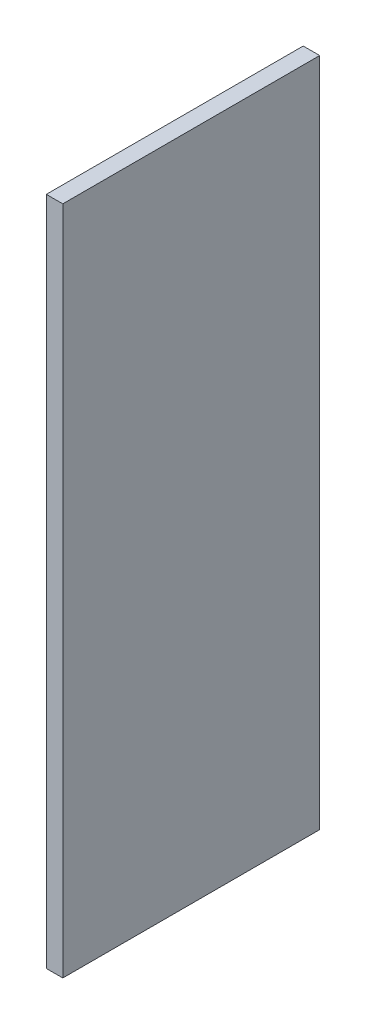
ISO-10303-21;
HEADER;
FILE_DESCRIPTION(('STEP AP214'),'2;1');
FILE_NAME('part.step','',(''),(''),'','','');
FILE_SCHEMA(('AUTOMOTIVE_DESIGN { 1 0 10303 214 1 1 1 1 }'));
ENDSEC;
DATA;
#1=APPLICATION_CONTEXT('core data for automotive mechanical design processes');
#2=APPLICATION_PROTOCOL_DEFINITION('international standard','automotive_design',2000,#1);
#3=PRODUCT_CONTEXT('',#1,'mechanical');
#4=PRODUCT('Part','Part','',(#3));
#5=PRODUCT_RELATED_PRODUCT_CATEGORY('part','',(#4));
#6=PRODUCT_DEFINITION_FORMATION('','',#4);
#7=PRODUCT_DEFINITION_CONTEXT('part definition',#1,'design');
#8=PRODUCT_DEFINITION('design','',#6,#7);
#9=PRODUCT_DEFINITION_SHAPE('','',#8);
#10=(LENGTH_UNIT() NAMED_UNIT(*) SI_UNIT(.MILLI.,.METRE.));
#11=(NAMED_UNIT(*) PLANE_ANGLE_UNIT() SI_UNIT($,.RADIAN.));
#12=(NAMED_UNIT(*) SI_UNIT($,.STERADIAN.) SOLID_ANGLE_UNIT());
#13=UNCERTAINTY_MEASURE_WITH_UNIT(LENGTH_MEASURE(1.E-05),#10,'distance_accuracy_value','');
#14=(GEOMETRIC_REPRESENTATION_CONTEXT(3) GLOBAL_UNCERTAINTY_ASSIGNED_CONTEXT((#13)) GLOBAL_UNIT_ASSIGNED_CONTEXT((#10,
#11,#12)) REPRESENTATION_CONTEXT('',''));
#15=CARTESIAN_POINT('',(0.,0.,0.));
#16=DIRECTION('',(0.,0.,1.));
#17=DIRECTION('',(1.,0.,0.));
#18=AXIS2_PLACEMENT_3D('',#15,#16,#17);
#19=CARTESIAN_POINT('',(1518.99999242226,30.0000000000011,-492.5));
#20=DIRECTION('',(0.,1.,0.));
#21=DIRECTION('',(0.,0.,1.));
#22=AXIS2_PLACEMENT_3D('',#19,#20,#21);
#23=PLANE('',#22);
#24=DIRECTION('',(0.,0.,-1.));
#25=VECTOR('',#24,1.);
#26=CARTESIAN_POINT('',(1488.99999242226,30.0000000000011,-492.5));
#27=LINE('',#26,#25);
#28=CARTESIAN_POINT('',(1488.99999242226,30.0000000000009,-492.5));
#29=VERTEX_POINT('',#28);
#30=CARTESIAN_POINT('',(1488.99999242226,30.0000000000009,-960.));
#31=VERTEX_POINT('',#30);
#32=EDGE_CURVE('E61',#29,#31,#27,.T.);
#33=ORIENTED_EDGE('',*,*,#32,.T.);
#34=DIRECTION('',(-1.,0.,0.));
#35=VECTOR('',#34,1.);
#36=CARTESIAN_POINT('',(1518.99999242226,30.0000000000009,-960.));
#37=LINE('',#36,#35);
#38=CARTESIAN_POINT('',(1518.99999242226,30.0000000000009,-960.));
#39=VERTEX_POINT('',#38);
#40=EDGE_CURVE('E11',#39,#31,#37,.T.);
#41=ORIENTED_EDGE('',*,*,#40,.F.);
#42=DIRECTION('',(0.,0.,-1.));
#43=VECTOR('',#42,1.);
#44=CARTESIAN_POINT('',(1518.99999242226,30.0000000000011,-492.5));
#45=LINE('',#44,#43);
#46=CARTESIAN_POINT('',(1518.99999242226,30.0000000000009,-492.5));
#47=VERTEX_POINT('',#46);
#48=EDGE_CURVE('E80',#47,#39,#45,.T.);
#49=ORIENTED_EDGE('',*,*,#48,.F.);
#50=DIRECTION('',(-1.,0.,0.));
#51=VECTOR('',#50,1.);
#52=CARTESIAN_POINT('',(1518.99999242226,30.0000000000009,-492.5));
#53=LINE('',#52,#51);
#54=EDGE_CURVE('E73',#47,#29,#53,.T.);
#55=ORIENTED_EDGE('',*,*,#54,.T.);
#56=EDGE_LOOP('',(#33,#41,#49,#55));
#57=FACE_BOUND('',#56,.T.);
#58=ADVANCED_FACE('F17',(#57),#23,.F.);
#59=CARTESIAN_POINT('',(1518.99999242226,30.0000000000009,-960.));
#60=DIRECTION('',(0.,0.,1.));
#61=DIRECTION('',(0.,-1.,0.));
#62=AXIS2_PLACEMENT_3D('',#59,#60,#61);
#63=PLANE('',#62);
#64=DIRECTION('',(0.,1.,0.));
#65=VECTOR('',#64,1.);
#66=CARTESIAN_POINT('',(1488.99999242226,30.0000000000009,-960.));
#67=LINE('',#66,#65);
#68=CARTESIAN_POINT('',(1488.99999242226,1250.,-960.));
#69=VERTEX_POINT('',#68);
#70=EDGE_CURVE('E57',#31,#69,#67,.T.);
#71=ORIENTED_EDGE('',*,*,#70,.T.);
#72=DIRECTION('',(-1.,0.,0.));
#73=VECTOR('',#72,1.);
#74=CARTESIAN_POINT('',(1518.99999242226,1250.,-960.));
#75=LINE('',#74,#73);
#76=CARTESIAN_POINT('',(1518.99999242226,1250.,-960.));
#77=VERTEX_POINT('',#76);
#78=EDGE_CURVE('E24',#77,#69,#75,.T.);
#79=ORIENTED_EDGE('',*,*,#78,.F.);
#80=DIRECTION('',(0.,1.,0.));
#81=VECTOR('',#80,1.);
#82=CARTESIAN_POINT('',(1518.99999242226,30.0000000000009,-960.));
#83=LINE('',#82,#81);
#84=EDGE_CURVE('E69',#39,#77,#83,.T.);
#85=ORIENTED_EDGE('',*,*,#84,.F.);
#86=ORIENTED_EDGE('',*,*,#40,.T.);
#87=EDGE_LOOP('',(#71,#79,#85,#86));
#88=FACE_BOUND('',#87,.T.);
#89=ADVANCED_FACE('F68',(#88),#63,.F.);
#90=CARTESIAN_POINT('',(1518.99999242226,1250.,-960.));
#91=DIRECTION('',(0.,-1.,0.));
#92=DIRECTION('',(0.,0.,-1.));
#93=AXIS2_PLACEMENT_3D('',#90,#91,#92);
#94=PLANE('',#93);
#95=DIRECTION('',(0.,0.,1.));
#96=VECTOR('',#95,1.);
#97=CARTESIAN_POINT('',(1488.99999242226,1250.,-960.));
#98=LINE('',#97,#96);
#99=CARTESIAN_POINT('',(1488.99999242226,1250.,-492.5));
#100=VERTEX_POINT('',#99);
#101=EDGE_CURVE('E62',#69,#100,#98,.T.);
#102=ORIENTED_EDGE('',*,*,#101,.T.);
#103=DIRECTION('',(-1.,0.,0.));
#104=VECTOR('',#103,1.);
#105=CARTESIAN_POINT('',(1518.99999242226,1250.,-492.5));
#106=LINE('',#105,#104);
#107=CARTESIAN_POINT('',(1518.99999242226,1250.,-492.5));
#108=VERTEX_POINT('',#107);
#109=EDGE_CURVE('E85',#108,#100,#106,.T.);
#110=ORIENTED_EDGE('',*,*,#109,.F.);
#111=DIRECTION('',(0.,0.,1.));
#112=VECTOR('',#111,1.);
#113=CARTESIAN_POINT('',(1518.99999242226,1250.,-960.));
#114=LINE('',#113,#112);
#115=EDGE_CURVE('E36',#77,#108,#114,.T.);
#116=ORIENTED_EDGE('',*,*,#115,.F.);
#117=ORIENTED_EDGE('',*,*,#78,.T.);
#118=EDGE_LOOP('',(#102,#110,#116,#117));
#119=FACE_BOUND('',#118,.T.);
#120=ADVANCED_FACE('F88',(#119),#94,.F.);
#121=CARTESIAN_POINT('',(1518.99999242226,1250.,-492.5));
#122=DIRECTION('',(0.,0.,-1.));
#123=DIRECTION('',(0.,1.,0.));
#124=AXIS2_PLACEMENT_3D('',#121,#122,#123);
#125=PLANE('',#124);
#126=DIRECTION('',(0.,-1.,0.));
#127=VECTOR('',#126,1.);
#128=CARTESIAN_POINT('',(1488.99999242226,1250.,-492.5));
#129=LINE('',#128,#127);
#130=EDGE_CURVE('E77',#100,#29,#129,.T.);
#131=ORIENTED_EDGE('',*,*,#130,.T.);
#132=ORIENTED_EDGE('',*,*,#54,.F.);
#133=DIRECTION('',(0.,-1.,0.));
#134=VECTOR('',#133,1.);
#135=CARTESIAN_POINT('',(1518.99999242226,1250.,-492.5));
#136=LINE('',#135,#134);
#137=EDGE_CURVE('E31',#108,#47,#136,.T.);
#138=ORIENTED_EDGE('',*,*,#137,.F.);
#139=ORIENTED_EDGE('',*,*,#109,.T.);
#140=EDGE_LOOP('',(#131,#132,#138,#139));
#141=FACE_BOUND('',#140,.T.);
#142=ADVANCED_FACE('F90',(#141),#125,.F.);
#143=CARTESIAN_POINT('',(1518.99999242226,30.0000000000009,-492.5));
#144=DIRECTION('',(-1.,0.,0.));
#145=DIRECTION('',(0.,1.,0.));
#146=AXIS2_PLACEMENT_3D('',#143,#144,#145);
#147=PLANE('',#146);
#148=ORIENTED_EDGE('',*,*,#48,.T.);
#149=ORIENTED_EDGE('',*,*,#84,.T.);
#150=ORIENTED_EDGE('',*,*,#115,.T.);
#151=ORIENTED_EDGE('',*,*,#137,.T.);
#152=EDGE_LOOP('',(#148,#149,#150,#151));
#153=FACE_BOUND('',#152,.T.);
#154=ADVANCED_FACE('F91',(#153),#147,.F.);
#155=CARTESIAN_POINT('',(1488.99999242226,30.0000000000009,-492.5));
#156=DIRECTION('',(-1.,0.,0.));
#157=DIRECTION('',(0.,1.,0.));
#158=AXIS2_PLACEMENT_3D('',#155,#156,#157);
#159=PLANE('',#158);
#160=ORIENTED_EDGE('',*,*,#32,.F.);
#161=ORIENTED_EDGE('',*,*,#130,.F.);
#162=ORIENTED_EDGE('',*,*,#101,.F.);
#163=ORIENTED_EDGE('',*,*,#70,.F.);
#164=EDGE_LOOP('',(#160,#161,#162,#163));
#165=FACE_BOUND('',#164,.T.);
#166=ADVANCED_FACE('F58',(#165),#159,.T.);
#167=CLOSED_SHELL('',(#58,#89,#120,#142,#154,#166));
#168=MANIFOLD_SOLID_BREP('B1',#167);
#169=ADVANCED_BREP_SHAPE_REPRESENTATION('',(#18,#168),#14);
#170=SHAPE_DEFINITION_REPRESENTATION(#9,#169);
ENDSEC;
END-ISO-10303-21;
